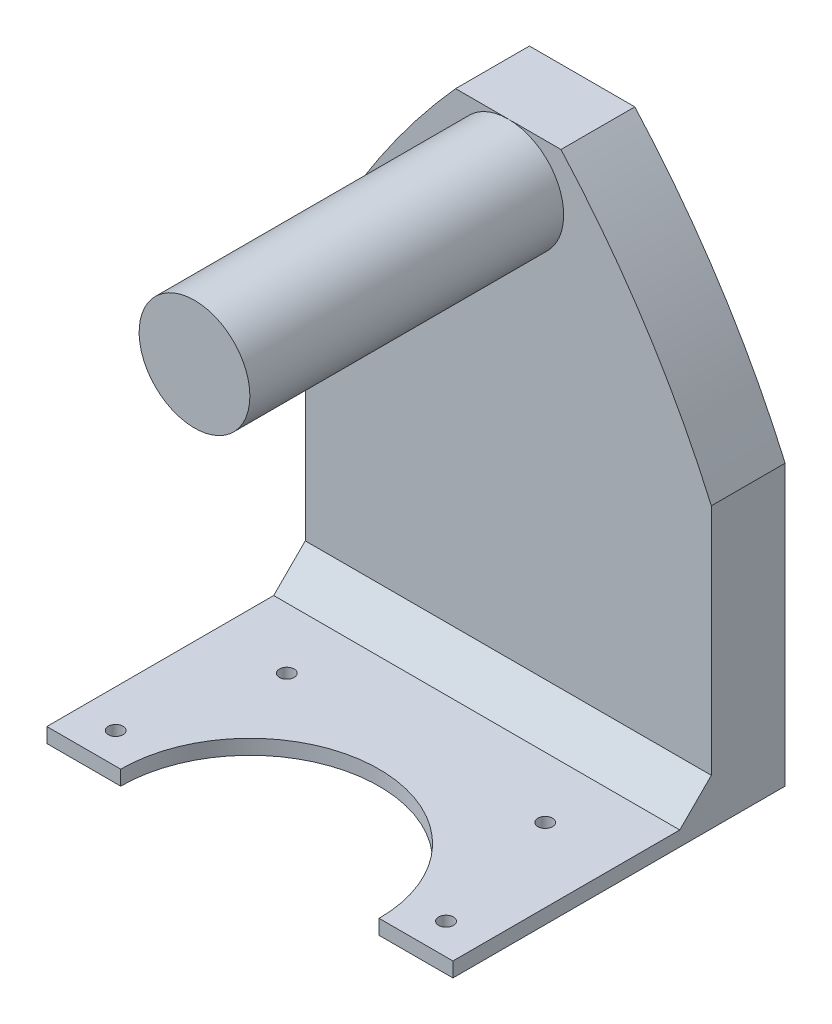
ISO-10303-21;
HEADER;
FILE_DESCRIPTION(('STEP AP214'),'2;1');
FILE_NAME('part.step','',(''),(''),'','','');
FILE_SCHEMA(('AUTOMOTIVE_DESIGN { 1 0 10303 214 1 1 1 1 }'));
ENDSEC;
DATA;
#1=APPLICATION_CONTEXT('core data for automotive mechanical design processes');
#2=APPLICATION_PROTOCOL_DEFINITION('international standard','automotive_design',2000,#1);
#3=PRODUCT_CONTEXT('',#1,'mechanical');
#4=PRODUCT('Part','Part','',(#3));
#5=PRODUCT_RELATED_PRODUCT_CATEGORY('part','',(#4));
#6=PRODUCT_DEFINITION_FORMATION('','',#4);
#7=PRODUCT_DEFINITION_CONTEXT('part definition',#1,'design');
#8=PRODUCT_DEFINITION('design','',#6,#7);
#9=PRODUCT_DEFINITION_SHAPE('','',#8);
#10=(LENGTH_UNIT() NAMED_UNIT(*) SI_UNIT(.MILLI.,.METRE.));
#11=(NAMED_UNIT(*) PLANE_ANGLE_UNIT() SI_UNIT($,.RADIAN.));
#12=(NAMED_UNIT(*) SI_UNIT($,.STERADIAN.) SOLID_ANGLE_UNIT());
#13=UNCERTAINTY_MEASURE_WITH_UNIT(LENGTH_MEASURE(1.E-05),#10,'distance_accuracy_value','');
#14=(GEOMETRIC_REPRESENTATION_CONTEXT(3) GLOBAL_UNCERTAINTY_ASSIGNED_CONTEXT((#13)) GLOBAL_UNIT_ASSIGNED_CONTEXT((#10,
#11,#12)) REPRESENTATION_CONTEXT('',''));
#15=CARTESIAN_POINT('',(0.,0.,0.));
#16=DIRECTION('',(0.,0.,1.));
#17=DIRECTION('',(1.,0.,0.));
#18=AXIS2_PLACEMENT_3D('',#15,#16,#17);
#19=CARTESIAN_POINT('',(-55.,4.,-45.));
#20=DIRECTION('',(0.,0.,1.));
#21=DIRECTION('',(1.,0.,0.));
#22=AXIS2_PLACEMENT_3D('',#19,#20,#21);
#23=PLANE('',#22);
#24=DIRECTION('',(0.,-1.,0.));
#25=VECTOR('',#24,1.);
#26=CARTESIAN_POINT('',(-55.,4.,-45.));
#27=LINE('',#26,#25);
#28=CARTESIAN_POINT('',(-55.,75.7739176689224,-45.));
#29=VERTEX_POINT('',#28);
#30=CARTESIAN_POINT('',(-55.,0.,-45.));
#31=VERTEX_POINT('',#30);
#32=EDGE_CURVE('E188',#29,#31,#27,.T.);
#33=ORIENTED_EDGE('',*,*,#32,.F.);
#34=CARTESIAN_POINT('',(162.542532164706,-19.615521590142,-45.));
#35=DIRECTION('',(0.,0.,1.));
#36=DIRECTION('',(1.,0.,0.));
#37=AXIS2_PLACEMENT_3D('',#34,#35,#36);
#38=CIRCLE('',#37,237.537151668515);
#39=CARTESIAN_POINT('',(-14.2766261114211,139.,-45.));
#40=VERTEX_POINT('',#39);
#41=EDGE_CURVE('E119',#29,#40,#38,.F.);
#42=ORIENTED_EDGE('',*,*,#41,.T.);
#43=DIRECTION('',(-1.,0.,0.));
#44=VECTOR('',#43,1.);
#45=CARTESIAN_POINT('',(-55.,139.,-45.));
#46=LINE('',#45,#44);
#47=CARTESIAN_POINT('',(14.2766261114211,139.,-45.));
#48=VERTEX_POINT('',#47);
#49=EDGE_CURVE('E143',#48,#40,#46,.T.);
#50=ORIENTED_EDGE('',*,*,#49,.F.);
#51=CARTESIAN_POINT('',(-162.542532164706,-19.615521590142,-45.));
#52=DIRECTION('',(0.,0.,1.));
#53=DIRECTION('',(1.,0.,0.));
#54=AXIS2_PLACEMENT_3D('',#51,#52,#53);
#55=CIRCLE('',#54,237.537151668515);
#56=CARTESIAN_POINT('',(55.,75.7739176689224,-45.));
#57=VERTEX_POINT('',#56);
#58=EDGE_CURVE('E55',#48,#57,#55,.F.);
#59=ORIENTED_EDGE('',*,*,#58,.T.);
#60=DIRECTION('',(0.,-1.,0.));
#61=VECTOR('',#60,1.);
#62=CARTESIAN_POINT('',(55.,4.,-45.));
#63=LINE('',#62,#61);
#64=CARTESIAN_POINT('',(55.,0.,-45.));
#65=VERTEX_POINT('',#64);
#66=EDGE_CURVE('E158',#57,#65,#63,.T.);
#67=ORIENTED_EDGE('',*,*,#66,.T.);
#68=DIRECTION('',(-1.,0.,0.));
#69=VECTOR('',#68,1.);
#70=CARTESIAN_POINT('',(-55.,0.,-45.));
#71=LINE('',#70,#69);
#72=EDGE_CURVE('E255',#65,#31,#71,.T.);
#73=ORIENTED_EDGE('',*,*,#72,.T.);
#74=EDGE_LOOP('',(#33,#42,#50,#59,#67,#73));
#75=FACE_BOUND('',#74,.T.);
#76=ADVANCED_FACE('F33',(#75),#23,.F.);
#77=CARTESIAN_POINT('',(-55.,139.,-25.));
#78=DIRECTION('',(0.,0.,-1.));
#79=DIRECTION('',(-1.,0.,0.));
#80=AXIS2_PLACEMENT_3D('',#77,#78,#79);
#81=PLANE('',#80);
#82=DIRECTION('',(1.,0.,0.));
#83=VECTOR('',#82,1.);
#84=CARTESIAN_POINT('',(-55.,139.,-25.));
#85=LINE('',#84,#83);
#86=CARTESIAN_POINT('',(-14.2766261114211,139.,-25.));
#87=VERTEX_POINT('',#86);
#88=CARTESIAN_POINT('',(0.,139.,-25.));
#89=VERTEX_POINT('',#88);
#90=EDGE_CURVE('E131',#87,#89,#85,.T.);
#91=ORIENTED_EDGE('',*,*,#90,.F.);
#92=CARTESIAN_POINT('',(162.542532164706,-19.615521590142,-25.));
#93=DIRECTION('',(0.,0.,-1.));
#94=DIRECTION('',(1.,0.,0.));
#95=AXIS2_PLACEMENT_3D('',#92,#93,#94);
#96=CIRCLE('',#95,237.537151668515);
#97=CARTESIAN_POINT('',(-55.,75.7739176689224,-25.));
#98=VERTEX_POINT('',#97);
#99=EDGE_CURVE('E47',#98,#87,#96,.T.);
#100=ORIENTED_EDGE('',*,*,#99,.F.);
#101=DIRECTION('',(0.,-1.,0.));
#102=VECTOR('',#101,1.);
#103=CARTESIAN_POINT('',(-55.,139.,-25.));
#104=LINE('',#103,#102);
#105=CARTESIAN_POINT('',(-55.,12.5478353378447,-25.));
#106=VERTEX_POINT('',#105);
#107=EDGE_CURVE('E128',#98,#106,#104,.T.);
#108=ORIENTED_EDGE('',*,*,#107,.T.);
#109=DIRECTION('',(-1.,0.,0.));
#110=VECTOR('',#109,1.);
#111=CARTESIAN_POINT('',(-55.,12.5478353378447,-25.));
#112=LINE('',#111,#110);
#113=CARTESIAN_POINT('',(55.,12.5478353378447,-25.));
#114=VERTEX_POINT('',#113);
#115=EDGE_CURVE('E162',#106,#114,#112,.F.);
#116=ORIENTED_EDGE('',*,*,#115,.T.);
#117=DIRECTION('',(0.,-1.,0.));
#118=VECTOR('',#117,1.);
#119=CARTESIAN_POINT('',(55.,139.,-25.));
#120=LINE('',#119,#118);
#121=CARTESIAN_POINT('',(55.,75.7739176689224,-25.));
#122=VERTEX_POINT('',#121);
#123=EDGE_CURVE('E138',#122,#114,#120,.T.);
#124=ORIENTED_EDGE('',*,*,#123,.F.);
#125=CARTESIAN_POINT('',(-162.542532164706,-19.615521590142,-25.));
#126=DIRECTION('',(0.,0.,-1.));
#127=DIRECTION('',(-1.,0.,0.));
#128=AXIS2_PLACEMENT_3D('',#125,#126,#127);
#129=CIRCLE('',#128,237.537151668515);
#130=CARTESIAN_POINT('',(14.2766261114211,139.,-25.));
#131=VERTEX_POINT('',#130);
#132=EDGE_CURVE('E167',#131,#122,#129,.T.);
#133=ORIENTED_EDGE('',*,*,#132,.F.);
#134=EDGE_CURVE('E175',#89,#131,#85,.T.);
#135=ORIENTED_EDGE('',*,*,#134,.F.);
#136=CARTESIAN_POINT('',(0.,124.,-25.));
#137=DIRECTION('',(0.,0.,1.));
#138=DIRECTION('',(1.,0.,0.));
#139=AXIS2_PLACEMENT_3D('',#136,#137,#138);
#140=CIRCLE('',#139,15.);
#141=EDGE_CURVE('E182',#89,#89,#140,.T.);
#142=ORIENTED_EDGE('',*,*,#141,.F.);
#143=EDGE_LOOP('',(#91,#100,#108,#116,#124,#133,#135,#142));
#144=FACE_BOUND('',#143,.T.);
#145=ADVANCED_FACE('F126',(#144),#81,.F.);
#146=CARTESIAN_POINT('',(0.,4.,45.));
#147=DIRECTION('',(0.,-1.,0.));
#148=DIRECTION('',(0.,0.,-1.));
#149=AXIS2_PLACEMENT_3D('',#146,#147,#148);
#150=PLANE('',#149);
#151=CARTESIAN_POINT('',(44.7420335951858,4.,36.6071183960611));
#152=DIRECTION('',(0.,1.,0.));
#153=DIRECTION('',(0.,0.,1.));
#154=AXIS2_PLACEMENT_3D('',#151,#152,#153);
#155=CIRCLE('',#154,2.);
#156=CARTESIAN_POINT('',(44.7420335951858,4.,38.6071183960611));
#157=VERTEX_POINT('',#156);
#158=EDGE_CURVE('E149',#157,#157,#155,.T.);
#159=ORIENTED_EDGE('',*,*,#158,.F.);
#160=EDGE_LOOP('',(#159));
#161=FACE_BOUND('',#160,.T.);
#162=CARTESIAN_POINT('',(-44.7420335951858,4.,36.6071183960611));
#163=DIRECTION('',(0.,1.,0.));
#164=DIRECTION('',(0.,0.,1.));
#165=AXIS2_PLACEMENT_3D('',#162,#163,#164);
#166=CIRCLE('',#165,2.);
#167=CARTESIAN_POINT('',(-44.7420335951858,4.,38.6071183960611));
#168=VERTEX_POINT('',#167);
#169=EDGE_CURVE('E455',#168,#168,#166,.T.);
#170=ORIENTED_EDGE('',*,*,#169,.F.);
#171=EDGE_LOOP('',(#170));
#172=FACE_BOUND('',#171,.T.);
#173=CARTESIAN_POINT('',(35.,4.,0.));
#174=DIRECTION('',(0.,1.,0.));
#175=DIRECTION('',(0.,0.,1.));
#176=AXIS2_PLACEMENT_3D('',#173,#174,#175);
#177=CIRCLE('',#176,2.);
#178=CARTESIAN_POINT('',(35.,4.,2.));
#179=VERTEX_POINT('',#178);
#180=EDGE_CURVE('E461',#179,#179,#177,.T.);
#181=ORIENTED_EDGE('',*,*,#180,.F.);
#182=EDGE_LOOP('',(#181));
#183=FACE_BOUND('',#182,.T.);
#184=CARTESIAN_POINT('',(-35.,4.,0.));
#185=DIRECTION('',(0.,1.,0.));
#186=DIRECTION('',(0.,0.,1.));
#187=AXIS2_PLACEMENT_3D('',#184,#185,#186);
#188=CIRCLE('',#187,2.);
#189=CARTESIAN_POINT('',(-35.,4.,2.));
#190=VERTEX_POINT('',#189);
#191=EDGE_CURVE('E256',#190,#190,#188,.T.);
#192=ORIENTED_EDGE('',*,*,#191,.F.);
#193=EDGE_LOOP('',(#192));
#194=FACE_BOUND('',#193,.T.);
#195=DIRECTION('',(1.,0.,0.));
#196=VECTOR('',#195,1.);
#197=CARTESIAN_POINT('',(55.,4.,-16.4521646621552));
#198=LINE('',#197,#196);
#199=CARTESIAN_POINT('',(-55.,4.,-16.4521646621551));
#200=VERTEX_POINT('',#199);
#201=CARTESIAN_POINT('',(55.,4.,-16.4521646621551));
#202=VERTEX_POINT('',#201);
#203=EDGE_CURVE('E137',#200,#202,#198,.T.);
#204=ORIENTED_EDGE('',*,*,#203,.F.);
#205=DIRECTION('',(0.,0.,1.));
#206=VECTOR('',#205,1.);
#207=CARTESIAN_POINT('',(-55.,4.,45.));
#208=LINE('',#207,#206);
#209=CARTESIAN_POINT('',(-55.,4.,45.));
#210=VERTEX_POINT('',#209);
#211=EDGE_CURVE('E153',#200,#210,#208,.T.);
#212=ORIENTED_EDGE('',*,*,#211,.T.);
#213=DIRECTION('',(1.,0.,0.));
#214=VECTOR('',#213,1.);
#215=CARTESIAN_POINT('',(-55.,4.,45.));
#216=LINE('',#215,#214);
#217=CARTESIAN_POINT('',(-35.,4.,45.));
#218=VERTEX_POINT('',#217);
#219=EDGE_CURVE('E247',#210,#218,#216,.T.);
#220=ORIENTED_EDGE('',*,*,#219,.T.);
#221=CARTESIAN_POINT('',(0.,4.,45.));
#222=DIRECTION('',(0.,-1.,0.));
#223=DIRECTION('',(0.,0.,-1.));
#224=AXIS2_PLACEMENT_3D('',#221,#222,#223);
#225=CIRCLE('',#224,35.);
#226=CARTESIAN_POINT('',(35.,4.,45.));
#227=VERTEX_POINT('',#226);
#228=EDGE_CURVE('E249',#218,#227,#225,.T.);
#229=ORIENTED_EDGE('',*,*,#228,.T.);
#230=DIRECTION('',(1.,0.,0.));
#231=VECTOR('',#230,1.);
#232=CARTESIAN_POINT('',(35.,4.,45.));
#233=LINE('',#232,#231);
#234=CARTESIAN_POINT('',(55.,4.,45.));
#235=VERTEX_POINT('',#234);
#236=EDGE_CURVE('E251',#227,#235,#233,.T.);
#237=ORIENTED_EDGE('',*,*,#236,.T.);
#238=DIRECTION('',(0.,0.,-1.));
#239=VECTOR('',#238,1.);
#240=CARTESIAN_POINT('',(55.,4.,45.));
#241=LINE('',#240,#239);
#242=EDGE_CURVE('E237',#235,#202,#241,.T.);
#243=ORIENTED_EDGE('',*,*,#242,.T.);
#244=EDGE_LOOP('',(#204,#212,#220,#229,#237,#243));
#245=FACE_BOUND('',#244,.T.);
#246=ADVANCED_FACE('F213',(#161,#172,#183,#194,#245),#150,.F.);
#247=CARTESIAN_POINT('',(0.,0.,45.));
#248=DIRECTION('',(0.,-1.,0.));
#249=DIRECTION('',(0.,0.,-1.));
#250=AXIS2_PLACEMENT_3D('',#247,#248,#249);
#251=PLANE('',#250);
#252=CARTESIAN_POINT('',(-44.7420335951858,0.,36.6071183960611));
#253=DIRECTION('',(0.,1.,0.));
#254=DIRECTION('',(0.,0.,1.));
#255=AXIS2_PLACEMENT_3D('',#252,#253,#254);
#256=CIRCLE('',#255,2.);
#257=CARTESIAN_POINT('',(-44.7420335951858,0.,38.6071183960611));
#258=VERTEX_POINT('',#257);
#259=EDGE_CURVE('E453',#258,#258,#256,.T.);
#260=ORIENTED_EDGE('',*,*,#259,.T.);
#261=EDGE_LOOP('',(#260));
#262=FACE_BOUND('',#261,.T.);
#263=CARTESIAN_POINT('',(-35.,0.,0.));
#264=DIRECTION('',(0.,1.,0.));
#265=DIRECTION('',(0.,0.,1.));
#266=AXIS2_PLACEMENT_3D('',#263,#264,#265);
#267=CIRCLE('',#266,2.);
#268=CARTESIAN_POINT('',(-35.,0.,2.));
#269=VERTEX_POINT('',#268);
#270=EDGE_CURVE('E243',#269,#269,#267,.T.);
#271=ORIENTED_EDGE('',*,*,#270,.T.);
#272=EDGE_LOOP('',(#271));
#273=FACE_BOUND('',#272,.T.);
#274=DIRECTION('',(0.,0.,-1.));
#275=VECTOR('',#274,1.);
#276=CARTESIAN_POINT('',(55.,0.,45.));
#277=LINE('',#276,#275);
#278=CARTESIAN_POINT('',(55.,0.,45.));
#279=VERTEX_POINT('',#278);
#280=EDGE_CURVE('E231',#279,#65,#277,.T.);
#281=ORIENTED_EDGE('',*,*,#280,.F.);
#282=DIRECTION('',(1.,0.,0.));
#283=VECTOR('',#282,1.);
#284=CARTESIAN_POINT('',(35.,0.,45.));
#285=LINE('',#284,#283);
#286=CARTESIAN_POINT('',(35.,0.,45.));
#287=VERTEX_POINT('',#286);
#288=EDGE_CURVE('E240',#287,#279,#285,.T.);
#289=ORIENTED_EDGE('',*,*,#288,.F.);
#290=CARTESIAN_POINT('',(0.,0.,45.));
#291=DIRECTION('',(0.,-1.,0.));
#292=DIRECTION('',(0.,0.,-1.));
#293=AXIS2_PLACEMENT_3D('',#290,#291,#292);
#294=CIRCLE('',#293,35.);
#295=CARTESIAN_POINT('',(-35.,0.,45.));
#296=VERTEX_POINT('',#295);
#297=EDGE_CURVE('E262',#296,#287,#294,.T.);
#298=ORIENTED_EDGE('',*,*,#297,.F.);
#299=DIRECTION('',(1.,0.,0.));
#300=VECTOR('',#299,1.);
#301=CARTESIAN_POINT('',(-55.,0.,45.));
#302=LINE('',#301,#300);
#303=CARTESIAN_POINT('',(-55.,0.,45.));
#304=VERTEX_POINT('',#303);
#305=EDGE_CURVE('E260',#304,#296,#302,.T.);
#306=ORIENTED_EDGE('',*,*,#305,.F.);
#307=DIRECTION('',(0.,0.,1.));
#308=VECTOR('',#307,1.);
#309=CARTESIAN_POINT('',(-55.,0.,45.));
#310=LINE('',#309,#308);
#311=EDGE_CURVE('E258',#31,#304,#310,.T.);
#312=ORIENTED_EDGE('',*,*,#311,.F.);
#313=ORIENTED_EDGE('',*,*,#72,.F.);
#314=EDGE_LOOP('',(#281,#289,#298,#306,#312,#313));
#315=FACE_BOUND('',#314,.T.);
#316=CARTESIAN_POINT('',(35.,0.,0.));
#317=DIRECTION('',(0.,1.,0.));
#318=DIRECTION('',(0.,0.,1.));
#319=AXIS2_PLACEMENT_3D('',#316,#317,#318);
#320=CIRCLE('',#319,2.);
#321=CARTESIAN_POINT('',(35.,0.,2.));
#322=VERTEX_POINT('',#321);
#323=EDGE_CURVE('E458',#322,#322,#320,.T.);
#324=ORIENTED_EDGE('',*,*,#323,.T.);
#325=EDGE_LOOP('',(#324));
#326=FACE_BOUND('',#325,.T.);
#327=CARTESIAN_POINT('',(44.7420335951858,0.,36.6071183960611));
#328=DIRECTION('',(0.,1.,0.));
#329=DIRECTION('',(0.,0.,1.));
#330=AXIS2_PLACEMENT_3D('',#327,#328,#329);
#331=CIRCLE('',#330,2.);
#332=CARTESIAN_POINT('',(44.7420335951858,0.,38.6071183960611));
#333=VERTEX_POINT('',#332);
#334=EDGE_CURVE('E141',#333,#333,#331,.T.);
#335=ORIENTED_EDGE('',*,*,#334,.T.);
#336=EDGE_LOOP('',(#335));
#337=FACE_BOUND('',#336,.T.);
#338=ADVANCED_FACE('F219',(#262,#273,#315,#326,#337),#251,.T.);
#339=CARTESIAN_POINT('',(55.,4.,45.));
#340=DIRECTION('',(-1.,0.,0.));
#341=DIRECTION('',(0.,0.,1.));
#342=AXIS2_PLACEMENT_3D('',#339,#340,#341);
#343=PLANE('',#342);
#344=ORIENTED_EDGE('',*,*,#66,.F.);
#345=DIRECTION('',(0.,0.,1.));
#346=VECTOR('',#345,1.);
#347=CARTESIAN_POINT('',(55.,75.7739176689224,-110.));
#348=LINE('',#347,#346);
#349=EDGE_CURVE('E176',#57,#122,#348,.T.);
#350=ORIENTED_EDGE('',*,*,#349,.T.);
#351=ORIENTED_EDGE('',*,*,#123,.T.);
#352=DIRECTION('',(0.,0.707106781186544,-0.707106781186551));
#353=VECTOR('',#352,1.);
#354=CARTESIAN_POINT('',(55.,14.,-26.4521646621553));
#355=LINE('',#354,#353);
#356=EDGE_CURVE('E156',#114,#202,#355,.F.);
#357=ORIENTED_EDGE('',*,*,#356,.T.);
#358=ORIENTED_EDGE('',*,*,#242,.F.);
#359=DIRECTION('',(0.,-1.,0.));
#360=VECTOR('',#359,1.);
#361=CARTESIAN_POINT('',(55.,4.,45.));
#362=LINE('',#361,#360);
#363=EDGE_CURVE('E253',#235,#279,#362,.T.);
#364=ORIENTED_EDGE('',*,*,#363,.T.);
#365=ORIENTED_EDGE('',*,*,#280,.T.);
#366=EDGE_LOOP('',(#344,#350,#351,#357,#358,#364,#365));
#367=FACE_BOUND('',#366,.T.);
#368=ADVANCED_FACE('F217',(#367),#343,.F.);
#369=CARTESIAN_POINT('',(-55.,4.,45.));
#370=DIRECTION('',(1.,0.,0.));
#371=DIRECTION('',(0.,0.,-1.));
#372=AXIS2_PLACEMENT_3D('',#369,#370,#371);
#373=PLANE('',#372);
#374=ORIENTED_EDGE('',*,*,#107,.F.);
#375=DIRECTION('',(0.,0.,1.));
#376=VECTOR('',#375,1.);
#377=CARTESIAN_POINT('',(-55.,75.7739176689224,-110.));
#378=LINE('',#377,#376);
#379=EDGE_CURVE('E116',#29,#98,#378,.T.);
#380=ORIENTED_EDGE('',*,*,#379,.F.);
#381=ORIENTED_EDGE('',*,*,#32,.T.);
#382=ORIENTED_EDGE('',*,*,#311,.T.);
#383=DIRECTION('',(0.,-1.,0.));
#384=VECTOR('',#383,1.);
#385=CARTESIAN_POINT('',(-55.,4.,45.));
#386=LINE('',#385,#384);
#387=EDGE_CURVE('E234',#210,#304,#386,.T.);
#388=ORIENTED_EDGE('',*,*,#387,.F.);
#389=ORIENTED_EDGE('',*,*,#211,.F.);
#390=DIRECTION('',(0.,-0.707106781186544,0.707106781186551));
#391=VECTOR('',#390,1.);
#392=CARTESIAN_POINT('',(-55.,14.,-26.4521646621553));
#393=LINE('',#392,#391);
#394=EDGE_CURVE('E135',#200,#106,#393,.F.);
#395=ORIENTED_EDGE('',*,*,#394,.T.);
#396=EDGE_LOOP('',(#374,#380,#381,#382,#388,#389,#395));
#397=FACE_BOUND('',#396,.T.);
#398=ADVANCED_FACE('F133',(#397),#373,.F.);
#399=CARTESIAN_POINT('',(-55.,4.,45.));
#400=DIRECTION('',(0.,0.,-1.));
#401=DIRECTION('',(-1.,0.,0.));
#402=AXIS2_PLACEMENT_3D('',#399,#400,#401);
#403=PLANE('',#402);
#404=ORIENTED_EDGE('',*,*,#305,.T.);
#405=DIRECTION('',(0.,-1.,0.));
#406=VECTOR('',#405,1.);
#407=CARTESIAN_POINT('',(-35.,4.,45.));
#408=LINE('',#407,#406);
#409=EDGE_CURVE('E269',#218,#296,#408,.T.);
#410=ORIENTED_EDGE('',*,*,#409,.F.);
#411=ORIENTED_EDGE('',*,*,#219,.F.);
#412=ORIENTED_EDGE('',*,*,#387,.T.);
#413=EDGE_LOOP('',(#404,#410,#411,#412));
#414=FACE_BOUND('',#413,.T.);
#415=ADVANCED_FACE('F225',(#414),#403,.F.);
#416=CARTESIAN_POINT('',(0.,4.,45.));
#417=DIRECTION('',(0.,-1.,0.));
#418=DIRECTION('',(0.,0.,-1.));
#419=AXIS2_PLACEMENT_3D('',#416,#417,#418);
#420=CYLINDRICAL_SURFACE('',#419,35.);
#421=ORIENTED_EDGE('',*,*,#297,.T.);
#422=DIRECTION('',(0.,-1.,0.));
#423=VECTOR('',#422,1.);
#424=CARTESIAN_POINT('',(35.,4.,45.));
#425=LINE('',#424,#423);
#426=EDGE_CURVE('E266',#227,#287,#425,.T.);
#427=ORIENTED_EDGE('',*,*,#426,.F.);
#428=ORIENTED_EDGE('',*,*,#228,.F.);
#429=ORIENTED_EDGE('',*,*,#409,.T.);
#430=EDGE_LOOP('',(#421,#427,#428,#429));
#431=FACE_BOUND('',#430,.T.);
#432=ADVANCED_FACE('F284',(#431),#420,.F.);
#433=CARTESIAN_POINT('',(35.,4.,45.));
#434=DIRECTION('',(0.,0.,-1.));
#435=DIRECTION('',(-1.,0.,0.));
#436=AXIS2_PLACEMENT_3D('',#433,#434,#435);
#437=PLANE('',#436);
#438=ORIENTED_EDGE('',*,*,#288,.T.);
#439=ORIENTED_EDGE('',*,*,#363,.F.);
#440=ORIENTED_EDGE('',*,*,#236,.F.);
#441=ORIENTED_EDGE('',*,*,#426,.T.);
#442=EDGE_LOOP('',(#438,#439,#440,#441));
#443=FACE_BOUND('',#442,.T.);
#444=ADVANCED_FACE('F288',(#443),#437,.F.);
#445=CARTESIAN_POINT('',(-35.,4.,0.));
#446=DIRECTION('',(0.,-1.,0.));
#447=DIRECTION('',(0.,0.,-1.));
#448=AXIS2_PLACEMENT_3D('',#445,#446,#447);
#449=CYLINDRICAL_SURFACE('',#448,2.);
#450=ORIENTED_EDGE('',*,*,#191,.T.);
#451=EDGE_LOOP('',(#450));
#452=FACE_BOUND('',#451,.T.);
#453=ORIENTED_EDGE('',*,*,#270,.F.);
#454=EDGE_LOOP('',(#453));
#455=FACE_BOUND('',#454,.T.);
#456=ADVANCED_FACE('F302',(#452,#455),#449,.F.);
#457=CARTESIAN_POINT('',(35.,4.,0.));
#458=DIRECTION('',(0.,-1.,0.));
#459=DIRECTION('',(0.,0.,-1.));
#460=AXIS2_PLACEMENT_3D('',#457,#458,#459);
#461=CYLINDRICAL_SURFACE('',#460,2.);
#462=ORIENTED_EDGE('',*,*,#180,.T.);
#463=EDGE_LOOP('',(#462));
#464=FACE_BOUND('',#463,.T.);
#465=ORIENTED_EDGE('',*,*,#323,.F.);
#466=EDGE_LOOP('',(#465));
#467=FACE_BOUND('',#466,.T.);
#468=ADVANCED_FACE('F328',(#464,#467),#461,.F.);
#469=CARTESIAN_POINT('',(-44.7420335951858,4.,36.6071183960611));
#470=DIRECTION('',(0.,-1.,0.));
#471=DIRECTION('',(0.,0.,-1.));
#472=AXIS2_PLACEMENT_3D('',#469,#470,#471);
#473=CYLINDRICAL_SURFACE('',#472,2.);
#474=ORIENTED_EDGE('',*,*,#169,.T.);
#475=EDGE_LOOP('',(#474));
#476=FACE_BOUND('',#475,.T.);
#477=ORIENTED_EDGE('',*,*,#259,.F.);
#478=EDGE_LOOP('',(#477));
#479=FACE_BOUND('',#478,.T.);
#480=ADVANCED_FACE('F335',(#476,#479),#473,.F.);
#481=CARTESIAN_POINT('',(44.7420335951858,4.,36.6071183960611));
#482=DIRECTION('',(0.,-1.,0.));
#483=DIRECTION('',(0.,0.,-1.));
#484=AXIS2_PLACEMENT_3D('',#481,#482,#483);
#485=CYLINDRICAL_SURFACE('',#484,2.);
#486=ORIENTED_EDGE('',*,*,#158,.T.);
#487=EDGE_LOOP('',(#486));
#488=FACE_BOUND('',#487,.T.);
#489=ORIENTED_EDGE('',*,*,#334,.F.);
#490=EDGE_LOOP('',(#489));
#491=FACE_BOUND('',#490,.T.);
#492=ADVANCED_FACE('F342',(#488,#491),#485,.F.);
#493=CARTESIAN_POINT('',(0.,139.,0.));
#494=DIRECTION('',(0.,1.,0.));
#495=DIRECTION('',(0.,0.,1.));
#496=AXIS2_PLACEMENT_3D('',#493,#494,#495);
#497=PLANE('',#496);
#498=DIRECTION('',(0.,0.,1.));
#499=VECTOR('',#498,1.);
#500=CARTESIAN_POINT('',(-14.2766261114211,139.,-110.));
#501=LINE('',#500,#499);
#502=EDGE_CURVE('E11',#87,#40,#501,.F.);
#503=ORIENTED_EDGE('',*,*,#502,.F.);
#504=ORIENTED_EDGE('',*,*,#90,.T.);
#505=ORIENTED_EDGE('',*,*,#134,.T.);
#506=DIRECTION('',(0.,0.,1.));
#507=VECTOR('',#506,1.);
#508=CARTESIAN_POINT('',(14.2766261114211,139.,-110.));
#509=LINE('',#508,#507);
#510=EDGE_CURVE('E41',#48,#131,#509,.T.);
#511=ORIENTED_EDGE('',*,*,#510,.F.);
#512=ORIENTED_EDGE('',*,*,#49,.T.);
#513=EDGE_LOOP('',(#503,#504,#505,#511,#512));
#514=FACE_BOUND('',#513,.T.);
#515=ADVANCED_FACE('F178',(#514),#497,.T.);
#516=CARTESIAN_POINT('',(0.,14.,-26.4521646621553));
#517=DIRECTION('',(0.,-0.707106781186551,-0.707106781186544));
#518=DIRECTION('',(1.,0.,0.));
#519=AXIS2_PLACEMENT_3D('',#516,#517,#518);
#520=PLANE('',#519);
#521=ORIENTED_EDGE('',*,*,#394,.F.);
#522=ORIENTED_EDGE('',*,*,#203,.T.);
#523=ORIENTED_EDGE('',*,*,#356,.F.);
#524=ORIENTED_EDGE('',*,*,#115,.F.);
#525=EDGE_LOOP('',(#521,#522,#523,#524));
#526=FACE_BOUND('',#525,.T.);
#527=ADVANCED_FACE('F35',(#526),#520,.F.);
#528=CARTESIAN_POINT('',(0.,124.,60.));
#529=DIRECTION('',(0.,0.,-1.));
#530=DIRECTION('',(-1.,0.,0.));
#531=AXIS2_PLACEMENT_3D('',#528,#529,#530);
#532=CYLINDRICAL_SURFACE('',#531,15.);
#533=CARTESIAN_POINT('',(0.,124.,60.));
#534=DIRECTION('',(0.,0.,1.));
#535=DIRECTION('',(1.,0.,0.));
#536=AXIS2_PLACEMENT_3D('',#533,#534,#535);
#537=CIRCLE('',#536,15.);
#538=CARTESIAN_POINT('',(15.,124.,60.));
#539=VERTEX_POINT('',#538);
#540=EDGE_CURVE('E179',#539,#539,#537,.T.);
#541=ORIENTED_EDGE('',*,*,#540,.F.);
#542=EDGE_LOOP('',(#541));
#543=FACE_BOUND('',#542,.T.);
#544=ORIENTED_EDGE('',*,*,#141,.T.);
#545=EDGE_LOOP('',(#544));
#546=FACE_BOUND('',#545,.T.);
#547=ADVANCED_FACE('F194',(#543,#546),#532,.T.);
#548=CARTESIAN_POINT('',(0.,124.,60.));
#549=DIRECTION('',(0.,0.,1.));
#550=DIRECTION('',(1.,0.,0.));
#551=AXIS2_PLACEMENT_3D('',#548,#549,#550);
#552=PLANE('',#551);
#553=ORIENTED_EDGE('',*,*,#540,.T.);
#554=EDGE_LOOP('',(#553));
#555=FACE_BOUND('',#554,.T.);
#556=ADVANCED_FACE('F196',(#555),#552,.T.);
#557=CARTESIAN_POINT('',(-162.542532164706,-19.615521590142,-110.));
#558=DIRECTION('',(0.,0.,1.));
#559=DIRECTION('',(1.,0.,0.));
#560=AXIS2_PLACEMENT_3D('',#557,#558,#559);
#561=CYLINDRICAL_SURFACE('',#560,237.537151668515);
#562=ORIENTED_EDGE('',*,*,#510,.T.);
#563=ORIENTED_EDGE('',*,*,#132,.T.);
#564=ORIENTED_EDGE('',*,*,#349,.F.);
#565=ORIENTED_EDGE('',*,*,#58,.F.);
#566=EDGE_LOOP('',(#562,#563,#564,#565));
#567=FACE_BOUND('',#566,.T.);
#568=ADVANCED_FACE('F166',(#567),#561,.T.);
#569=CARTESIAN_POINT('',(162.542532164706,-19.615521590142,-110.));
#570=DIRECTION('',(0.,0.,1.));
#571=DIRECTION('',(1.,0.,0.));
#572=AXIS2_PLACEMENT_3D('',#569,#570,#571);
#573=CYLINDRICAL_SURFACE('',#572,237.537151668515);
#574=ORIENTED_EDGE('',*,*,#379,.T.);
#575=ORIENTED_EDGE('',*,*,#99,.T.);
#576=ORIENTED_EDGE('',*,*,#502,.T.);
#577=ORIENTED_EDGE('',*,*,#41,.F.);
#578=EDGE_LOOP('',(#574,#575,#576,#577));
#579=FACE_BOUND('',#578,.T.);
#580=ADVANCED_FACE('F117',(#579),#573,.T.);
#581=CLOSED_SHELL('',(#76,#145,#246,#338,#368,#398,#415,#432,#444,#456,#468,#480,#492,#515,#527,
#547,#556,#568,#580));
#582=MANIFOLD_SOLID_BREP('B2',#581);
#583=ADVANCED_BREP_SHAPE_REPRESENTATION('',(#18,#582),#14);
#584=SHAPE_DEFINITION_REPRESENTATION(#9,#583);
ENDSEC;
END-ISO-10303-21;
